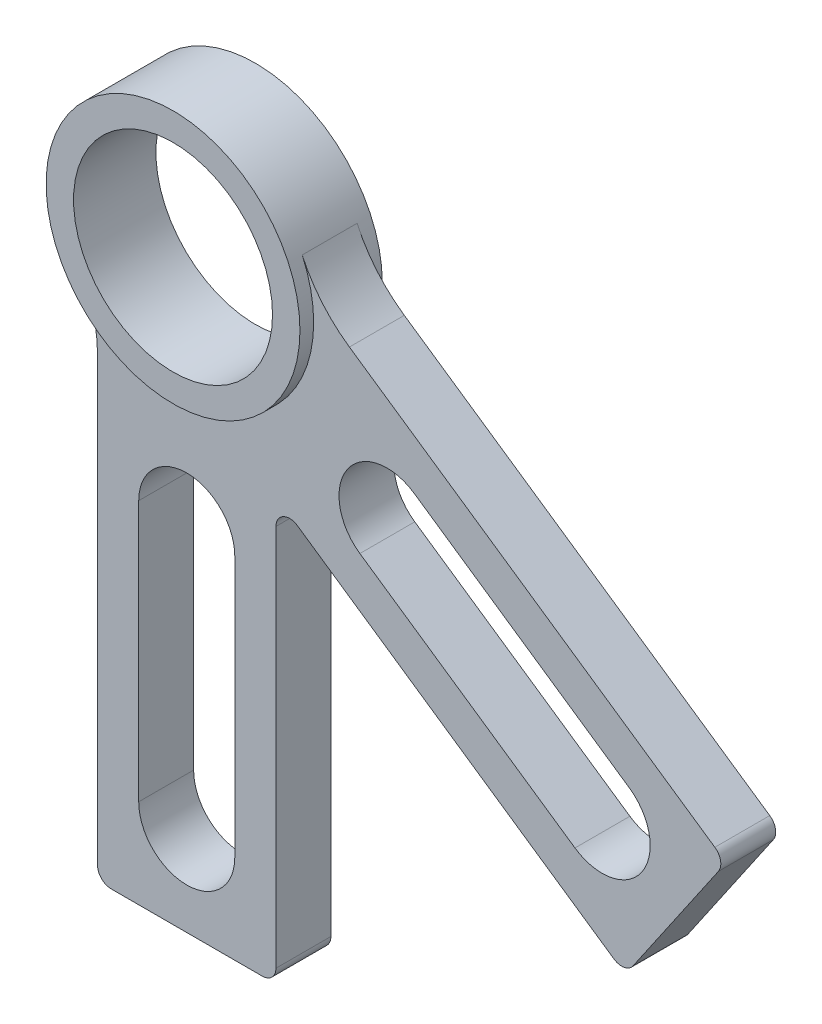
ISO-10303-21;
HEADER;
FILE_DESCRIPTION(('STEP AP214'),'2;1');
FILE_NAME('part.step','',(''),(''),'','','');
FILE_SCHEMA(('AUTOMOTIVE_DESIGN { 1 0 10303 214 1 1 1 1 }'));
ENDSEC;
DATA;
#1=APPLICATION_CONTEXT('core data for automotive mechanical design processes');
#2=APPLICATION_PROTOCOL_DEFINITION('international standard','automotive_design',2000,#1);
#3=PRODUCT_CONTEXT('',#1,'mechanical');
#4=PRODUCT('Part','Part','',(#3));
#5=PRODUCT_RELATED_PRODUCT_CATEGORY('part','',(#4));
#6=PRODUCT_DEFINITION_FORMATION('','',#4);
#7=PRODUCT_DEFINITION_CONTEXT('part definition',#1,'design');
#8=PRODUCT_DEFINITION('design','',#6,#7);
#9=PRODUCT_DEFINITION_SHAPE('','',#8);
#10=(LENGTH_UNIT() NAMED_UNIT(*) SI_UNIT(.MILLI.,.METRE.));
#11=(NAMED_UNIT(*) PLANE_ANGLE_UNIT() SI_UNIT($,.RADIAN.));
#12=(NAMED_UNIT(*) SI_UNIT($,.STERADIAN.) SOLID_ANGLE_UNIT());
#13=UNCERTAINTY_MEASURE_WITH_UNIT(LENGTH_MEASURE(1.E-05),#10,'distance_accuracy_value','');
#14=(GEOMETRIC_REPRESENTATION_CONTEXT(3) GLOBAL_UNCERTAINTY_ASSIGNED_CONTEXT((#13)) GLOBAL_UNIT_ASSIGNED_CONTEXT((#10,
#11,#12)) REPRESENTATION_CONTEXT('',''));
#15=CARTESIAN_POINT('',(0.,0.,0.));
#16=DIRECTION('',(0.,0.,1.));
#17=DIRECTION('',(1.,0.,0.));
#18=AXIS2_PLACEMENT_3D('',#15,#16,#17);
#19=CARTESIAN_POINT('',(0.,-27.9580697939255,-4.7625));
#20=DIRECTION('',(0.,0.,1.));
#21=DIRECTION('',(1.,0.,0.));
#22=AXIS2_PLACEMENT_3D('',#19,#20,#21);
#23=CYLINDRICAL_SURFACE('',#22,5.55624999999843);
#24=DIRECTION('',(0.,0.,1.));
#25=VECTOR('',#24,1.);
#26=CARTESIAN_POINT('',(-5.55624999999843,-27.9580697939256,-4.7625));
#27=LINE('',#26,#25);
#28=CARTESIAN_POINT('',(-5.55624999999845,-27.9580697939256,-3.175));
#29=VERTEX_POINT('',#28);
#30=CARTESIAN_POINT('',(-5.55624999999843,-27.9580697939256,3.175));
#31=VERTEX_POINT('',#30);
#32=EDGE_CURVE('E409',#29,#31,#27,.T.);
#33=ORIENTED_EDGE('',*,*,#32,.F.);
#34=CARTESIAN_POINT('',(0.,-27.9580697939255,-3.175));
#35=DIRECTION('',(0.,0.,1.));
#36=DIRECTION('',(1.,0.,0.));
#37=AXIS2_PLACEMENT_3D('',#34,#35,#36);
#38=CIRCLE('',#37,5.55624999999843);
#39=CARTESIAN_POINT('',(5.55624999999841,-27.9580697939255,-3.175));
#40=VERTEX_POINT('',#39);
#41=EDGE_CURVE('E594',#40,#29,#38,.T.);
#42=ORIENTED_EDGE('',*,*,#41,.F.);
#43=DIRECTION('',(0.,0.,1.));
#44=VECTOR('',#43,1.);
#45=CARTESIAN_POINT('',(5.55624999999843,-27.9580697939256,-4.7625));
#46=LINE('',#45,#44);
#47=CARTESIAN_POINT('',(5.55624999999843,-27.9580697939256,3.175));
#48=VERTEX_POINT('',#47);
#49=EDGE_CURVE('E380',#40,#48,#46,.T.);
#50=ORIENTED_EDGE('',*,*,#49,.T.);
#51=CARTESIAN_POINT('',(0.,-27.9580697939255,3.175));
#52=DIRECTION('',(0.,0.,1.));
#53=DIRECTION('',(1.,0.,0.));
#54=AXIS2_PLACEMENT_3D('',#51,#52,#53);
#55=CIRCLE('',#54,5.55624999999843);
#56=EDGE_CURVE('E548',#48,#31,#55,.T.);
#57=ORIENTED_EDGE('',*,*,#56,.T.);
#58=EDGE_LOOP('',(#33,#42,#50,#57));
#59=FACE_BOUND('',#58,.T.);
#60=ADVANCED_FACE('F207',(#59),#23,.F.);
#61=CARTESIAN_POINT('',(-5.55624999999843,0.,-4.7625));
#62=DIRECTION('',(1.,0.,0.));
#63=DIRECTION('',(0.,1.,0.));
#64=AXIS2_PLACEMENT_3D('',#61,#62,#63);
#65=PLANE('',#64);
#66=DIRECTION('',(0.,1.,0.));
#67=VECTOR('',#66,1.);
#68=CARTESIAN_POINT('',(-5.55624999999843,0.,-3.175));
#69=LINE('',#68,#67);
#70=CARTESIAN_POINT('',(-5.55624999999845,-58.1205697939288,-3.175));
#71=VERTEX_POINT('',#70);
#72=EDGE_CURVE('E596',#71,#29,#69,.T.);
#73=ORIENTED_EDGE('',*,*,#72,.T.);
#74=ORIENTED_EDGE('',*,*,#32,.T.);
#75=DIRECTION('',(0.,-1.,0.));
#76=VECTOR('',#75,1.);
#77=CARTESIAN_POINT('',(-5.55624999999843,0.,3.175));
#78=LINE('',#77,#76);
#79=CARTESIAN_POINT('',(-5.55624999999842,-58.1205697939288,3.175));
#80=VERTEX_POINT('',#79);
#81=EDGE_CURVE('E553',#31,#80,#78,.T.);
#82=ORIENTED_EDGE('',*,*,#81,.T.);
#83=DIRECTION('',(0.,0.,1.));
#84=VECTOR('',#83,1.);
#85=CARTESIAN_POINT('',(-5.55624999999842,-58.1205697939288,-4.7625));
#86=LINE('',#85,#84);
#87=EDGE_CURVE('E625',#71,#80,#86,.T.);
#88=ORIENTED_EDGE('',*,*,#87,.F.);
#89=EDGE_LOOP('',(#73,#74,#82,#88));
#90=FACE_BOUND('',#89,.T.);
#91=ADVANCED_FACE('F629',(#90),#65,.T.);
#92=CARTESIAN_POINT('',(0.,-58.1205697939288,-4.7625));
#93=DIRECTION('',(0.,0.,1.));
#94=DIRECTION('',(1.,0.,0.));
#95=AXIS2_PLACEMENT_3D('',#92,#93,#94);
#96=CYLINDRICAL_SURFACE('',#95,5.55624999999842);
#97=DIRECTION('',(0.,0.,1.));
#98=VECTOR('',#97,1.);
#99=CARTESIAN_POINT('',(5.55624999999842,-58.1205697939288,-4.7625));
#100=LINE('',#99,#98);
#101=CARTESIAN_POINT('',(5.55624999999842,-58.1205697939288,-3.175));
#102=VERTEX_POINT('',#101);
#103=CARTESIAN_POINT('',(5.55624999999842,-58.1205697939288,3.175));
#104=VERTEX_POINT('',#103);
#105=EDGE_CURVE('E382',#102,#104,#100,.T.);
#106=ORIENTED_EDGE('',*,*,#105,.F.);
#107=CARTESIAN_POINT('',(0.,-58.1205697939288,-3.175));
#108=DIRECTION('',(0.,0.,1.));
#109=DIRECTION('',(1.,0.,0.));
#110=AXIS2_PLACEMENT_3D('',#107,#108,#109);
#111=CIRCLE('',#110,5.55624999999842);
#112=EDGE_CURVE('E588',#71,#102,#111,.T.);
#113=ORIENTED_EDGE('',*,*,#112,.F.);
#114=ORIENTED_EDGE('',*,*,#87,.T.);
#115=CARTESIAN_POINT('',(0.,-58.1205697939288,3.175));
#116=DIRECTION('',(0.,0.,1.));
#117=DIRECTION('',(1.,0.,0.));
#118=AXIS2_PLACEMENT_3D('',#115,#116,#117);
#119=CIRCLE('',#118,5.55624999999842);
#120=EDGE_CURVE('E611',#80,#104,#119,.T.);
#121=ORIENTED_EDGE('',*,*,#120,.T.);
#122=EDGE_LOOP('',(#106,#113,#114,#121));
#123=FACE_BOUND('',#122,.T.);
#124=ADVANCED_FACE('F633',(#123),#96,.F.);
#125=CARTESIAN_POINT('',(23.1650589969967,-15.8792690951238,-4.7625));
#126=DIRECTION('',(0.,0.,1.));
#127=DIRECTION('',(1.,0.,0.));
#128=AXIS2_PLACEMENT_3D('',#125,#126,#127);
#129=CYLINDRICAL_SURFACE('',#128,5.5562499999984);
#130=DIRECTION('',(0.,0.,1.));
#131=VECTOR('',#130,1.);
#132=CARTESIAN_POINT('',(20.0235610567339,-20.4621617137443,-4.7625));
#133=LINE('',#132,#131);
#134=CARTESIAN_POINT('',(20.0235610567339,-20.4621617137443,-3.175));
#135=VERTEX_POINT('',#134);
#136=CARTESIAN_POINT('',(20.0235610567339,-20.4621617137443,3.175));
#137=VERTEX_POINT('',#136);
#138=EDGE_CURVE('E372',#135,#137,#133,.T.);
#139=ORIENTED_EDGE('',*,*,#138,.F.);
#140=CARTESIAN_POINT('',(23.1650589969967,-15.8792690951238,-3.175));
#141=DIRECTION('',(0.,0.,1.));
#142=DIRECTION('',(1.,0.,0.));
#143=AXIS2_PLACEMENT_3D('',#140,#141,#142);
#144=CIRCLE('',#143,5.5562499999984);
#145=CARTESIAN_POINT('',(26.3065569372595,-11.2963764765033,-3.175));
#146=VERTEX_POINT('',#145);
#147=EDGE_CURVE('E356',#146,#135,#144,.T.);
#148=ORIENTED_EDGE('',*,*,#147,.F.);
#149=DIRECTION('',(0.,0.,1.));
#150=VECTOR('',#149,1.);
#151=CARTESIAN_POINT('',(26.3065569372595,-11.2963764765033,-4.7625));
#152=LINE('',#151,#150);
#153=CARTESIAN_POINT('',(26.3065569372595,-11.2963764765033,3.175));
#154=VERTEX_POINT('',#153);
#155=EDGE_CURVE('E389',#146,#154,#152,.T.);
#156=ORIENTED_EDGE('',*,*,#155,.T.);
#157=CARTESIAN_POINT('',(23.1650589969967,-15.8792690951238,3.175));
#158=DIRECTION('',(0.,0.,1.));
#159=DIRECTION('',(1.,0.,0.));
#160=AXIS2_PLACEMENT_3D('',#157,#158,#159);
#161=CIRCLE('',#160,5.5562499999984);
#162=EDGE_CURVE('E379',#154,#137,#161,.T.);
#163=ORIENTED_EDGE('',*,*,#162,.T.);
#164=EDGE_LOOP('',(#139,#148,#156,#163));
#165=FACE_BOUND('',#164,.T.);
#166=ADVANCED_FACE('F377',(#165),#129,.F.);
#167=CARTESIAN_POINT('',(-3.14149794026282,-4.58289261862053,-4.7625));
#168=DIRECTION('',(0.565398954378175,0.82481756915579,0.));
#169=DIRECTION('',(-0.82481756915579,0.565398954378175,0.));
#170=AXIS2_PLACEMENT_3D('',#167,#168,#169);
#171=PLANE('',#170);
#172=DIRECTION('',(-0.82481756915579,0.565398954378175,0.));
#173=VECTOR('',#172,1.);
#174=CARTESIAN_POINT('',(-3.14149794026282,-4.58289261862053,-3.175));
#175=LINE('',#174,#173);
#176=CARTESIAN_POINT('',(44.902120986398,-37.5160076751779,-3.175));
#177=VERTEX_POINT('',#176);
#178=EDGE_CURVE('E360',#177,#135,#175,.T.);
#179=ORIENTED_EDGE('',*,*,#178,.T.);
#180=ORIENTED_EDGE('',*,*,#138,.T.);
#181=DIRECTION('',(0.82481756915579,-0.565398954378175,0.));
#182=VECTOR('',#181,1.);
#183=CARTESIAN_POINT('',(-3.14149794026282,-4.58289261862053,3.175));
#184=LINE('',#183,#182);
#185=CARTESIAN_POINT('',(44.9021209863981,-37.5160076751779,3.175));
#186=VERTEX_POINT('',#185);
#187=EDGE_CURVE('E610',#137,#186,#184,.T.);
#188=ORIENTED_EDGE('',*,*,#187,.T.);
#189=DIRECTION('',(0.,0.,1.));
#190=VECTOR('',#189,1.);
#191=CARTESIAN_POINT('',(44.9021209863981,-37.5160076751779,-4.7625));
#192=LINE('',#191,#190);
#193=EDGE_CURVE('E374',#177,#186,#192,.T.);
#194=ORIENTED_EDGE('',*,*,#193,.F.);
#195=EDGE_LOOP('',(#179,#180,#188,#194));
#196=FACE_BOUND('',#195,.T.);
#197=ADVANCED_FACE('F370',(#196),#171,.T.);
#198=CARTESIAN_POINT('',(48.0436189266609,-32.9331150565573,-4.7625));
#199=DIRECTION('',(0.,0.,1.));
#200=DIRECTION('',(1.,0.,0.));
#201=AXIS2_PLACEMENT_3D('',#198,#199,#200);
#202=CYLINDRICAL_SURFACE('',#201,5.5562499999984);
#203=DIRECTION('',(0.,0.,1.));
#204=VECTOR('',#203,1.);
#205=CARTESIAN_POINT('',(51.1851168669237,-28.3502224379368,-4.7625));
#206=LINE('',#205,#204);
#207=CARTESIAN_POINT('',(51.1851168669237,-28.3502224379368,-3.175));
#208=VERTEX_POINT('',#207);
#209=CARTESIAN_POINT('',(51.1851168669237,-28.3502224379368,3.175));
#210=VERTEX_POINT('',#209);
#211=EDGE_CURVE('E384',#208,#210,#206,.T.);
#212=ORIENTED_EDGE('',*,*,#211,.F.);
#213=CARTESIAN_POINT('',(48.0436189266609,-32.9331150565573,-3.175));
#214=DIRECTION('',(0.,0.,1.));
#215=DIRECTION('',(1.,0.,0.));
#216=AXIS2_PLACEMENT_3D('',#213,#214,#215);
#217=CIRCLE('',#216,5.5562499999984);
#218=EDGE_CURVE('E599',#177,#208,#217,.T.);
#219=ORIENTED_EDGE('',*,*,#218,.F.);
#220=ORIENTED_EDGE('',*,*,#193,.T.);
#221=CARTESIAN_POINT('',(48.0436189266609,-32.9331150565573,3.175));
#222=DIRECTION('',(0.,0.,1.));
#223=DIRECTION('',(1.,0.,0.));
#224=AXIS2_PLACEMENT_3D('',#221,#222,#223);
#225=CIRCLE('',#224,5.5562499999984);
#226=EDGE_CURVE('E538',#186,#210,#225,.T.);
#227=ORIENTED_EDGE('',*,*,#226,.T.);
#228=EDGE_LOOP('',(#212,#219,#220,#227));
#229=FACE_BOUND('',#228,.T.);
#230=ADVANCED_FACE('F606',(#229),#202,.F.);
#231=CARTESIAN_POINT('',(27.7878622659884,12.7088972427335,-4.7625));
#232=DIRECTION('',(0.,0.,1.));
#233=DIRECTION('',(1.,0.,0.));
#234=AXIS2_PLACEMENT_3D('',#231,#232,#233);
#235=CYLINDRICAL_SURFACE('',#234,15.8749999999984);
#236=CARTESIAN_POINT('',(27.7878622659884,12.7088972427335,-3.175));
#237=DIRECTION('',(0.,0.,1.));
#238=DIRECTION('',(1.,0.,0.));
#239=AXIS2_PLACEMENT_3D('',#236,#237,#238);
#240=CIRCLE('',#239,15.8749999999984);
#241=CARTESIAN_POINT('',(13.3511092184058,6.10618670515409,-3.175));
#242=VERTEX_POINT('',#241);
#243=CARTESIAN_POINT('',(18.8121538652358,-0.385081667613318,-3.175));
#244=VERTEX_POINT('',#243);
#245=EDGE_CURVE('E522',#242,#244,#240,.T.);
#246=ORIENTED_EDGE('',*,*,#245,.F.);
#247=DIRECTION('',(0.,0.,1.));
#248=VECTOR('',#247,1.);
#249=CARTESIAN_POINT('',(13.3511092184058,6.10618670515408,-4.7625));
#250=LINE('',#249,#248);
#251=CARTESIAN_POINT('',(13.3511092184058,6.10618670515408,3.175));
#252=VERTEX_POINT('',#251);
#253=EDGE_CURVE('E391',#242,#252,#250,.T.);
#254=ORIENTED_EDGE('',*,*,#253,.T.);
#255=CARTESIAN_POINT('',(27.7878622659884,12.7088972427335,3.175));
#256=DIRECTION('',(0.,0.,1.));
#257=DIRECTION('',(1.,0.,0.));
#258=AXIS2_PLACEMENT_3D('',#255,#256,#257);
#259=CIRCLE('',#258,15.8749999999984);
#260=CARTESIAN_POINT('',(18.8121538652358,-0.385081667613316,3.175));
#261=VERTEX_POINT('',#260);
#262=EDGE_CURVE('E500',#252,#261,#259,.T.);
#263=ORIENTED_EDGE('',*,*,#262,.T.);
#264=DIRECTION('',(0.,0.,1.));
#265=VECTOR('',#264,1.);
#266=CARTESIAN_POINT('',(18.8121538652358,-0.385081667613316,-4.7625));
#267=LINE('',#266,#265);
#268=EDGE_CURVE('E393',#244,#261,#267,.T.);
#269=ORIENTED_EDGE('',*,*,#268,.F.);
#270=EDGE_LOOP('',(#246,#254,#263,#269));
#271=FACE_BOUND('',#270,.T.);
#272=ADVANCED_FACE('F570',(#271),#235,.F.);
#273=CARTESIAN_POINT('',(5.83421046048889,8.51108629172498,-4.7625));
#274=DIRECTION('',(0.565398954378175,0.82481756915579,0.));
#275=DIRECTION('',(-0.82481756915579,0.565398954378175,0.));
#276=AXIS2_PLACEMENT_3D('',#273,#274,#275);
#277=PLANE('',#276);
#278=DIRECTION('',(0.82481756915579,-0.565398954378175,0.));
#279=VECTOR('',#278,1.);
#280=CARTESIAN_POINT('',(5.83421046048889,8.51108629172498,3.175));
#281=LINE('',#280,#279);
#282=CARTESIAN_POINT('',(61.0795177878399,-29.3586683852459,3.175));
#283=VERTEX_POINT('',#282);
#284=EDGE_CURVE('E564',#261,#283,#281,.T.);
#285=ORIENTED_EDGE('',*,*,#284,.T.);
#286=DIRECTION('',(0.,0.,1.));
#287=VECTOR('',#286,1.);
#288=CARTESIAN_POINT('',(61.0795177878399,-29.3586683852459,-4.7625));
#289=LINE('',#288,#287);
#290=CARTESIAN_POINT('',(61.0795177878399,-29.3586683852459,-3.175));
#291=VERTEX_POINT('',#290);
#292=EDGE_CURVE('E420',#283,#291,#289,.F.);
#293=ORIENTED_EDGE('',*,*,#292,.T.);
#294=DIRECTION('',(-0.82481756915579,0.565398954378175,0.));
#295=VECTOR('',#294,1.);
#296=CARTESIAN_POINT('',(5.83421046048889,8.51108629172498,-3.175));
#297=LINE('',#296,#295);
#298=EDGE_CURVE('E531',#291,#244,#297,.T.);
#299=ORIENTED_EDGE('',*,*,#298,.T.);
#300=ORIENTED_EDGE('',*,*,#268,.T.);
#301=EDGE_LOOP('',(#285,#293,#299,#300));
#302=FACE_BOUND('',#301,.T.);
#303=ADVANCED_FACE('F657',(#302),#277,.T.);
#304=CARTESIAN_POINT('',(56.5547052183859,-38.7673255170462,-4.7625));
#305=DIRECTION('',(0.82481756915579,-0.565398954378175,0.));
#306=DIRECTION('',(0.565398954378175,0.82481756915579,0.));
#307=AXIS2_PLACEMENT_3D('',#304,#305,#306);
#308=PLANE('',#307);
#309=DIRECTION('',(0.565398954378175,0.82481756915579,0.));
#310=VECTOR('',#309,1.);
#311=CARTESIAN_POINT('',(56.5547052183859,-38.7673255170462,-3.175));
#312=LINE('',#311,#310);
#313=CARTESIAN_POINT('',(51.6180655979723,-45.9690139177364,-3.175));
#314=VERTEX_POINT('',#313);
#315=CARTESIAN_POINT('',(61.4913448387994,-31.5656371163561,-3.175));
#316=VERTEX_POINT('',#315);
#317=EDGE_CURVE('E533',#314,#316,#312,.T.);
#318=ORIENTED_EDGE('',*,*,#317,.T.);
#319=DIRECTION('',(0.,0.,1.));
#320=VECTOR('',#319,1.);
#321=CARTESIAN_POINT('',(61.4913448387994,-31.5656371163561,-4.7625));
#322=LINE('',#321,#320);
#323=CARTESIAN_POINT('',(61.4913448387994,-31.5656371163561,3.175));
#324=VERTEX_POINT('',#323);
#325=EDGE_CURVE('E408',#316,#324,#322,.T.);
#326=ORIENTED_EDGE('',*,*,#325,.T.);
#327=DIRECTION('',(-0.565398954378175,-0.82481756915579,0.));
#328=VECTOR('',#327,1.);
#329=CARTESIAN_POINT('',(56.5547052183859,-38.7673255170462,3.175));
#330=LINE('',#329,#328);
#331=CARTESIAN_POINT('',(51.6180655979723,-45.9690139177364,3.175));
#332=VERTEX_POINT('',#331);
#333=EDGE_CURVE('E562',#324,#332,#330,.T.);
#334=ORIENTED_EDGE('',*,*,#333,.T.);
#335=DIRECTION('',(0.,0.,1.));
#336=VECTOR('',#335,1.);
#337=CARTESIAN_POINT('',(51.6180655979723,-45.9690139177364,-3.175));
#338=LINE('',#337,#336);
#339=EDGE_CURVE('E406',#332,#314,#338,.F.);
#340=ORIENTED_EDGE('',*,*,#339,.T.);
#341=EDGE_LOOP('',(#318,#326,#334,#340));
#342=FACE_BOUND('',#341,.T.);
#343=ADVANCED_FACE('F576',(#342),#308,.T.);
#344=CARTESIAN_POINT('',(-5.83421046048888,-8.51108629172497,-4.7625));
#345=DIRECTION('',(0.565398954378175,0.82481756915579,0.));
#346=DIRECTION('',(-0.82481756915579,0.565398954378175,0.));
#347=AXIS2_PLACEMENT_3D('',#344,#345,#346);
#348=PLANE('',#347);
#349=DIRECTION('',(-0.82481756915579,0.565398954378175,0.));
#350=VECTOR('',#349,1.);
#351=CARTESIAN_POINT('',(-5.83421046048888,-8.51108629172497,-3.175));
#352=LINE('',#351,#350);
#353=CARTESIAN_POINT('',(49.4110968668622,-46.3808409686959,-3.175));
#354=VERTEX_POINT('',#353);
#355=CARTESIAN_POINT('',(12.8038208400738,-21.2871519371155,-3.175));
#356=VERTEX_POINT('',#355);
#357=EDGE_CURVE('E536',#354,#356,#352,.T.);
#358=ORIENTED_EDGE('',*,*,#357,.F.);
#359=DIRECTION('',(0.,0.,1.));
#360=VECTOR('',#359,1.);
#361=CARTESIAN_POINT('',(49.4110968668622,-46.3808409686959,3.175));
#362=LINE('',#361,#360);
#363=CARTESIAN_POINT('',(49.4110968668622,-46.3808409686959,3.175));
#364=VERTEX_POINT('',#363);
#365=EDGE_CURVE('E428',#354,#364,#362,.T.);
#366=ORIENTED_EDGE('',*,*,#365,.T.);
#367=DIRECTION('',(0.82481756915579,-0.565398954378175,0.));
#368=VECTOR('',#367,1.);
#369=CARTESIAN_POINT('',(-5.83421046048888,-8.51108629172497,3.175));
#370=LINE('',#369,#368);
#371=CARTESIAN_POINT('',(12.8038208400738,-21.2871519371155,3.175));
#372=VERTEX_POINT('',#371);
#373=EDGE_CURVE('E559',#372,#364,#370,.T.);
#374=ORIENTED_EDGE('',*,*,#373,.F.);
#375=DIRECTION('',(0.,0.,1.));
#376=VECTOR('',#375,1.);
#377=CARTESIAN_POINT('',(12.8038208400738,-21.2871519371155,-4.7625));
#378=LINE('',#377,#376);
#379=EDGE_CURVE('E395',#356,#372,#378,.T.);
#380=ORIENTED_EDGE('',*,*,#379,.F.);
#381=EDGE_LOOP('',(#358,#366,#374,#380));
#382=FACE_BOUND('',#381,.T.);
#383=ADVANCED_FACE('F584',(#382),#348,.F.);
#384=CARTESIAN_POINT('',(11.9062499999984,-22.5965498281503,-4.7625));
#385=DIRECTION('',(0.,0.,1.));
#386=DIRECTION('',(1.,0.,0.));
#387=AXIS2_PLACEMENT_3D('',#384,#385,#386);
#388=CYLINDRICAL_SURFACE('',#387,1.5875);
#389=DIRECTION('',(0.,0.,1.));
#390=VECTOR('',#389,1.);
#391=CARTESIAN_POINT('',(10.3187499999984,-22.5965498281503,-4.7625));
#392=LINE('',#391,#390);
#393=CARTESIAN_POINT('',(10.3187499999984,-22.5965498281503,-3.175));
#394=VERTEX_POINT('',#393);
#395=CARTESIAN_POINT('',(10.3187499999984,-22.5965498281503,3.175));
#396=VERTEX_POINT('',#395);
#397=EDGE_CURVE('E397',#394,#396,#392,.T.);
#398=ORIENTED_EDGE('',*,*,#397,.F.);
#399=CARTESIAN_POINT('',(11.9062499999984,-22.5965498281503,-3.175));
#400=DIRECTION('',(0.,0.,1.));
#401=DIRECTION('',(1.,0.,0.));
#402=AXIS2_PLACEMENT_3D('',#399,#400,#401);
#403=CIRCLE('',#402,1.5875);
#404=EDGE_CURVE('E449',#356,#394,#403,.T.);
#405=ORIENTED_EDGE('',*,*,#404,.F.);
#406=ORIENTED_EDGE('',*,*,#379,.T.);
#407=CARTESIAN_POINT('',(11.9062499999984,-22.5965498281503,3.175));
#408=DIRECTION('',(0.,0.,1.));
#409=DIRECTION('',(1.,0.,0.));
#410=AXIS2_PLACEMENT_3D('',#407,#408,#409);
#411=CIRCLE('',#410,1.5875);
#412=EDGE_CURVE('E466',#372,#396,#411,.T.);
#413=ORIENTED_EDGE('',*,*,#412,.T.);
#414=EDGE_LOOP('',(#398,#405,#406,#413));
#415=FACE_BOUND('',#414,.T.);
#416=ADVANCED_FACE('F587',(#415),#388,.F.);
#417=CARTESIAN_POINT('',(10.3187499999984,0.,-4.7625));
#418=DIRECTION('',(-1.,0.,0.));
#419=DIRECTION('',(0.,-1.,0.));
#420=AXIS2_PLACEMENT_3D('',#417,#418,#419);
#421=PLANE('',#420);
#422=DIRECTION('',(0.,1.,0.));
#423=VECTOR('',#422,1.);
#424=CARTESIAN_POINT('',(10.3187499999984,0.,3.175));
#425=LINE('',#424,#423);
#426=CARTESIAN_POINT('',(10.3187499999984,-66.8518197939272,3.175));
#427=VERTEX_POINT('',#426);
#428=EDGE_CURVE('E443',#427,#396,#425,.T.);
#429=ORIENTED_EDGE('',*,*,#428,.F.);
#430=DIRECTION('',(0.,0.,1.));
#431=VECTOR('',#430,1.);
#432=CARTESIAN_POINT('',(10.3187499999984,-66.8518197939272,-3.175));
#433=LINE('',#432,#431);
#434=CARTESIAN_POINT('',(10.3187499999984,-66.8518197939272,-3.175));
#435=VERTEX_POINT('',#434);
#436=EDGE_CURVE('E215',#427,#435,#433,.F.);
#437=ORIENTED_EDGE('',*,*,#436,.T.);
#438=DIRECTION('',(0.,-1.,0.));
#439=VECTOR('',#438,1.);
#440=CARTESIAN_POINT('',(10.3187499999984,0.,-3.175));
#441=LINE('',#440,#439);
#442=EDGE_CURVE('E441',#394,#435,#441,.T.);
#443=ORIENTED_EDGE('',*,*,#442,.F.);
#444=ORIENTED_EDGE('',*,*,#397,.T.);
#445=EDGE_LOOP('',(#429,#437,#443,#444));
#446=FACE_BOUND('',#445,.T.);
#447=ADVANCED_FACE('F440',(#446),#421,.F.);
#448=CARTESIAN_POINT('',(0.,-68.4393197939272,-4.7625));
#449=DIRECTION('',(0.,-1.,0.));
#450=DIRECTION('',(1.,0.,0.));
#451=AXIS2_PLACEMENT_3D('',#448,#449,#450);
#452=PLANE('',#451);
#453=DIRECTION('',(1.,0.,0.));
#454=VECTOR('',#453,1.);
#455=CARTESIAN_POINT('',(0.,-68.4393197939272,-3.175));
#456=LINE('',#455,#454);
#457=CARTESIAN_POINT('',(-8.73124999999842,-68.4393197939272,-3.175));
#458=VERTEX_POINT('',#457);
#459=CARTESIAN_POINT('',(8.73124999999836,-68.4393197939272,-3.175));
#460=VERTEX_POINT('',#459);
#461=EDGE_CURVE('E450',#458,#460,#456,.T.);
#462=ORIENTED_EDGE('',*,*,#461,.T.);
#463=DIRECTION('',(0.,0.,1.));
#464=VECTOR('',#463,1.);
#465=CARTESIAN_POINT('',(8.73124999999836,-68.4393197939272,3.175));
#466=LINE('',#465,#464);
#467=CARTESIAN_POINT('',(8.73124999999836,-68.4393197939272,3.175));
#468=VERTEX_POINT('',#467);
#469=EDGE_CURVE('E433',#460,#468,#466,.T.);
#470=ORIENTED_EDGE('',*,*,#469,.T.);
#471=DIRECTION('',(-1.,0.,0.));
#472=VECTOR('',#471,1.);
#473=CARTESIAN_POINT('',(0.,-68.4393197939272,3.175));
#474=LINE('',#473,#472);
#475=CARTESIAN_POINT('',(-8.73124999999842,-68.4393197939272,3.175));
#476=VERTEX_POINT('',#475);
#477=EDGE_CURVE('E458',#468,#476,#474,.T.);
#478=ORIENTED_EDGE('',*,*,#477,.T.);
#479=DIRECTION('',(0.,0.,1.));
#480=VECTOR('',#479,1.);
#481=CARTESIAN_POINT('',(-8.73124999999842,-68.4393197939272,-4.7625));
#482=LINE('',#481,#480);
#483=EDGE_CURVE('E431',#476,#458,#482,.F.);
#484=ORIENTED_EDGE('',*,*,#483,.T.);
#485=EDGE_LOOP('',(#462,#470,#478,#484));
#486=FACE_BOUND('',#485,.T.);
#487=ADVANCED_FACE('F457',(#486),#452,.T.);
#488=CARTESIAN_POINT('',(-10.3187499999984,0.,-4.7625));
#489=DIRECTION('',(-1.,0.,0.));
#490=DIRECTION('',(0.,-1.,0.));
#491=AXIS2_PLACEMENT_3D('',#488,#489,#490);
#492=PLANE('',#491);
#493=DIRECTION('',(0.,-1.,0.));
#494=VECTOR('',#493,1.);
#495=CARTESIAN_POINT('',(-10.3187499999984,0.,-3.175));
#496=LINE('',#495,#494);
#497=CARTESIAN_POINT('',(-10.3187499999984,-15.7343197939272,-3.175));
#498=VERTEX_POINT('',#497);
#499=CARTESIAN_POINT('',(-10.3187499999984,-66.8518197939272,-3.175));
#500=VERTEX_POINT('',#499);
#501=EDGE_CURVE('E525',#498,#500,#496,.T.);
#502=ORIENTED_EDGE('',*,*,#501,.T.);
#503=DIRECTION('',(0.,0.,1.));
#504=VECTOR('',#503,1.);
#505=CARTESIAN_POINT('',(-10.3187499999984,-66.8518197939272,-4.7625));
#506=LINE('',#505,#504);
#507=CARTESIAN_POINT('',(-10.3187499999984,-66.8518197939272,3.175));
#508=VERTEX_POINT('',#507);
#509=EDGE_CURVE('E13',#500,#508,#506,.T.);
#510=ORIENTED_EDGE('',*,*,#509,.T.);
#511=DIRECTION('',(0.,1.,0.));
#512=VECTOR('',#511,1.);
#513=CARTESIAN_POINT('',(-10.3187499999984,0.,3.175));
#514=LINE('',#513,#512);
#515=CARTESIAN_POINT('',(-10.3187499999984,-15.7343197939272,3.175));
#516=VERTEX_POINT('',#515);
#517=EDGE_CURVE('E464',#508,#516,#514,.T.);
#518=ORIENTED_EDGE('',*,*,#517,.T.);
#519=DIRECTION('',(0.,0.,1.));
#520=VECTOR('',#519,1.);
#521=CARTESIAN_POINT('',(-10.3187499999984,-15.7343197939272,-4.7625));
#522=LINE('',#521,#520);
#523=EDGE_CURVE('E400',#498,#516,#522,.T.);
#524=ORIENTED_EDGE('',*,*,#523,.F.);
#525=EDGE_LOOP('',(#502,#510,#518,#524));
#526=FACE_BOUND('',#525,.T.);
#527=ADVANCED_FACE('F653',(#526),#492,.T.);
#528=CARTESIAN_POINT('',(3.14149794026284,4.58289261862055,-4.7625));
#529=DIRECTION('',(0.565398954378175,0.82481756915579,0.));
#530=DIRECTION('',(-0.82481756915579,0.565398954378175,0.));
#531=AXIS2_PLACEMENT_3D('',#528,#529,#530);
#532=PLANE('',#531);
#533=ORIENTED_EDGE('',*,*,#155,.F.);
#534=DIRECTION('',(-0.82481756915579,0.565398954378175,0.));
#535=VECTOR('',#534,1.);
#536=CARTESIAN_POINT('',(3.14149794026284,4.58289261862055,-3.175));
#537=LINE('',#536,#535);
#538=EDGE_CURVE('E363',#208,#146,#537,.T.);
#539=ORIENTED_EDGE('',*,*,#538,.F.);
#540=ORIENTED_EDGE('',*,*,#211,.T.);
#541=DIRECTION('',(0.82481756915579,-0.565398954378175,0.));
#542=VECTOR('',#541,1.);
#543=CARTESIAN_POINT('',(3.14149794026284,4.58289261862055,3.175));
#544=LINE('',#543,#542);
#545=EDGE_CURVE('E541',#154,#210,#544,.T.);
#546=ORIENTED_EDGE('',*,*,#545,.F.);
#547=EDGE_LOOP('',(#533,#539,#540,#546));
#548=FACE_BOUND('',#547,.T.);
#549=ADVANCED_FACE('F604',(#548),#532,.F.);
#550=CARTESIAN_POINT('',(-26.1937499999968,-15.7343197939272,-4.7625));
#551=DIRECTION('',(0.,0.,1.));
#552=DIRECTION('',(1.,0.,0.));
#553=AXIS2_PLACEMENT_3D('',#550,#551,#552);
#554=CYLINDRICAL_SURFACE('',#553,15.8749999999984);
#555=DIRECTION('',(0.,0.,1.));
#556=VECTOR('',#555,1.);
#557=CARTESIAN_POINT('',(-12.5851932668321,-7.55979787272684,-4.7625));
#558=LINE('',#557,#556);
#559=CARTESIAN_POINT('',(-12.5851932668321,-7.55979787272683,-3.175));
#560=VERTEX_POINT('',#559);
#561=CARTESIAN_POINT('',(-12.5851932668321,-7.55979787272683,3.175));
#562=VERTEX_POINT('',#561);
#563=EDGE_CURVE('E403',#560,#562,#558,.T.);
#564=ORIENTED_EDGE('',*,*,#563,.F.);
#565=CARTESIAN_POINT('',(-26.1937499999968,-15.7343197939272,-3.175));
#566=DIRECTION('',(0.,0.,1.));
#567=DIRECTION('',(1.,0.,0.));
#568=AXIS2_PLACEMENT_3D('',#565,#566,#567);
#569=CIRCLE('',#568,15.8749999999984);
#570=EDGE_CURVE('E523',#498,#560,#569,.T.);
#571=ORIENTED_EDGE('',*,*,#570,.F.);
#572=ORIENTED_EDGE('',*,*,#523,.T.);
#573=CARTESIAN_POINT('',(-26.1937499999968,-15.7343197939272,3.175));
#574=DIRECTION('',(0.,0.,1.));
#575=DIRECTION('',(1.,0.,0.));
#576=AXIS2_PLACEMENT_3D('',#573,#574,#575);
#577=CIRCLE('',#576,15.8749999999984);
#578=EDGE_CURVE('E468',#516,#562,#577,.T.);
#579=ORIENTED_EDGE('',*,*,#578,.T.);
#580=EDGE_LOOP('',(#564,#571,#572,#579));
#581=FACE_BOUND('',#580,.T.);
#582=ADVANCED_FACE('F507',(#581),#554,.F.);
#583=CARTESIAN_POINT('',(5.55624999999843,0.,-4.7625));
#584=DIRECTION('',(1.,0.,0.));
#585=DIRECTION('',(0.,1.,0.));
#586=AXIS2_PLACEMENT_3D('',#583,#584,#585);
#587=PLANE('',#586);
#588=ORIENTED_EDGE('',*,*,#49,.F.);
#589=DIRECTION('',(0.,1.,0.));
#590=VECTOR('',#589,1.);
#591=CARTESIAN_POINT('',(5.55624999999843,0.,-3.175));
#592=LINE('',#591,#590);
#593=EDGE_CURVE('E590',#102,#40,#592,.T.);
#594=ORIENTED_EDGE('',*,*,#593,.F.);
#595=ORIENTED_EDGE('',*,*,#105,.T.);
#596=DIRECTION('',(0.,-1.,0.));
#597=VECTOR('',#596,1.);
#598=CARTESIAN_POINT('',(5.55624999999843,0.,3.175));
#599=LINE('',#598,#597);
#600=EDGE_CURVE('E554',#48,#104,#599,.T.);
#601=ORIENTED_EDGE('',*,*,#600,.F.);
#602=EDGE_LOOP('',(#588,#594,#595,#601));
#603=FACE_BOUND('',#602,.T.);
#604=ADVANCED_FACE('F622',(#603),#587,.F.);
#605=CARTESIAN_POINT('',(0.,0.,4.7625));
#606=DIRECTION('',(0.,0.,1.));
#607=DIRECTION('',(1.,0.,0.));
#608=AXIS2_PLACEMENT_3D('',#605,#606,#607);
#609=PLANE('',#608);
#610=CARTESIAN_POINT('',(0.,0.,4.7625));
#611=DIRECTION('',(0.,0.,1.));
#612=DIRECTION('',(1.,0.,0.));
#613=AXIS2_PLACEMENT_3D('',#610,#611,#612);
#614=CIRCLE('',#613,11.5062);
#615=CARTESIAN_POINT('',(11.5062,0.,4.7625));
#616=VERTEX_POINT('',#615);
#617=EDGE_CURVE('E473',#616,#616,#614,.T.);
#618=ORIENTED_EDGE('',*,*,#617,.F.);
#619=EDGE_LOOP('',(#618));
#620=FACE_BOUND('',#619,.T.);
#621=CARTESIAN_POINT('',(0.,0.,4.7625));
#622=DIRECTION('',(0.,0.,1.));
#623=DIRECTION('',(1.,0.,0.));
#624=AXIS2_PLACEMENT_3D('',#621,#622,#623);
#625=CIRCLE('',#624,14.6812);
#626=CARTESIAN_POINT('',(14.6812,0.,4.7625));
#627=VERTEX_POINT('',#626);
#628=EDGE_CURVE('E477',#627,#627,#625,.T.);
#629=ORIENTED_EDGE('',*,*,#628,.T.);
#630=EDGE_LOOP('',(#629));
#631=FACE_BOUND('',#630,.T.);
#632=ADVANCED_FACE('F678',(#620,#631),#609,.T.);
#633=CARTESIAN_POINT('',(0.,0.,-4.7625));
#634=DIRECTION('',(0.,0.,1.));
#635=DIRECTION('',(1.,0.,0.));
#636=AXIS2_PLACEMENT_3D('',#633,#634,#635);
#637=CYLINDRICAL_SURFACE('',#636,14.6812);
#638=ORIENTED_EDGE('',*,*,#253,.F.);
#639=CARTESIAN_POINT('',(0.,0.,-3.175));
#640=DIRECTION('',(0.,0.,1.));
#641=DIRECTION('',(1.,0.,0.));
#642=AXIS2_PLACEMENT_3D('',#639,#640,#641);
#643=CIRCLE('',#642,14.6812);
#644=EDGE_CURVE('E518',#560,#242,#643,.T.);
#645=ORIENTED_EDGE('',*,*,#644,.F.);
#646=ORIENTED_EDGE('',*,*,#563,.T.);
#647=CARTESIAN_POINT('',(0.,0.,3.175));
#648=DIRECTION('',(0.,0.,1.));
#649=DIRECTION('',(1.,0.,0.));
#650=AXIS2_PLACEMENT_3D('',#647,#648,#649);
#651=CIRCLE('',#650,14.6812);
#652=EDGE_CURVE('E496',#562,#252,#651,.T.);
#653=ORIENTED_EDGE('',*,*,#652,.T.);
#654=EDGE_LOOP('',(#638,#645,#646,#653));
#655=FACE_BOUND('',#654,.T.);
#656=ORIENTED_EDGE('',*,*,#628,.F.);
#657=EDGE_LOOP('',(#656));
#658=FACE_BOUND('',#657,.T.);
#659=CARTESIAN_POINT('',(0.,0.,-4.7625));
#660=DIRECTION('',(0.,0.,1.));
#661=DIRECTION('',(1.,0.,0.));
#662=AXIS2_PLACEMENT_3D('',#659,#660,#661);
#663=CIRCLE('',#662,14.6812);
#664=CARTESIAN_POINT('',(14.6812,0.,-4.7625));
#665=VERTEX_POINT('',#664);
#666=EDGE_CURVE('E405',#665,#665,#663,.T.);
#667=ORIENTED_EDGE('',*,*,#666,.T.);
#668=EDGE_LOOP('',(#667));
#669=FACE_BOUND('',#668,.T.);
#670=ADVANCED_FACE('F516',(#655,#658,#669),#637,.T.);
#671=CARTESIAN_POINT('',(0.,0.,-4.7625));
#672=DIRECTION('',(0.,0.,1.));
#673=DIRECTION('',(1.,0.,0.));
#674=AXIS2_PLACEMENT_3D('',#671,#672,#673);
#675=CYLINDRICAL_SURFACE('',#674,11.5062);
#676=CARTESIAN_POINT('',(0.,0.,-4.7625));
#677=DIRECTION('',(0.,0.,1.));
#678=DIRECTION('',(1.,0.,0.));
#679=AXIS2_PLACEMENT_3D('',#676,#677,#678);
#680=CIRCLE('',#679,11.5062);
#681=CARTESIAN_POINT('',(11.5062,0.,-4.7625));
#682=VERTEX_POINT('',#681);
#683=EDGE_CURVE('E488',#682,#682,#680,.T.);
#684=CARTESIAN_POINT('',(11.5062,0.,-4.7625));
#685=CARTESIAN_POINT('',(11.5062,0.,-4.66328125));
#686=CARTESIAN_POINT('',(11.5062,0.,-4.5640625));
#687=CARTESIAN_POINT('',(11.5062,0.,-4.365625));
#688=CARTESIAN_POINT('',(11.5062,0.,-4.26640625));
#689=CARTESIAN_POINT('',(11.5062,0.,-4.06796875));
#690=CARTESIAN_POINT('',(11.5062,0.,-3.96875));
#691=CARTESIAN_POINT('',(11.5062,0.,-3.7703125));
#692=CARTESIAN_POINT('',(11.5062,0.,-3.67109375));
#693=CARTESIAN_POINT('',(11.5062,0.,-3.47265625));
#694=CARTESIAN_POINT('',(11.5062,0.,-3.3734375));
#695=CARTESIAN_POINT('',(11.5062,0.,-3.175));
#696=CARTESIAN_POINT('',(11.5062,0.,-3.07578125));
#697=CARTESIAN_POINT('',(11.5062,0.,-2.87734375));
#698=CARTESIAN_POINT('',(11.5062,0.,-2.778125));
#699=CARTESIAN_POINT('',(11.5062,0.,-2.5796875));
#700=CARTESIAN_POINT('',(11.5062,0.,-2.48046875));
#701=CARTESIAN_POINT('',(11.5062,0.,-2.28203125));
#702=CARTESIAN_POINT('',(11.5062,0.,-2.1828125));
#703=CARTESIAN_POINT('',(11.5062,0.,-1.984375));
#704=CARTESIAN_POINT('',(11.5062,0.,-1.88515625));
#705=CARTESIAN_POINT('',(11.5062,0.,-1.68671875));
#706=CARTESIAN_POINT('',(11.5062,0.,-1.5875));
#707=CARTESIAN_POINT('',(11.5062,0.,-1.3890625));
#708=CARTESIAN_POINT('',(11.5062,0.,-1.28984375));
#709=CARTESIAN_POINT('',(11.5062,0.,-1.09140625));
#710=CARTESIAN_POINT('',(11.5062,0.,-0.9921875));
#711=CARTESIAN_POINT('',(11.5062,0.,-0.79375));
#712=CARTESIAN_POINT('',(11.5062,0.,-0.69453125));
#713=CARTESIAN_POINT('',(11.5062,0.,-0.49609375));
#714=CARTESIAN_POINT('',(11.5062,0.,-0.396875));
#715=CARTESIAN_POINT('',(11.5062,0.,-0.1984375));
#716=CARTESIAN_POINT('',(11.5062,0.,-0.0992187500000001));
#717=CARTESIAN_POINT('',(11.5062,0.,0.0992187500000001));
#718=CARTESIAN_POINT('',(11.5062,0.,0.1984375));
#719=CARTESIAN_POINT('',(11.5062,0.,0.396875));
#720=CARTESIAN_POINT('',(11.5062,0.,0.49609375));
#721=CARTESIAN_POINT('',(11.5062,0.,0.69453125));
#722=CARTESIAN_POINT('',(11.5062,0.,0.793750000000001));
#723=CARTESIAN_POINT('',(11.5062,0.,0.992187500000001));
#724=CARTESIAN_POINT('',(11.5062,0.,1.09140625));
#725=CARTESIAN_POINT('',(11.5062,0.,1.28984375));
#726=CARTESIAN_POINT('',(11.5062,0.,1.3890625));
#727=CARTESIAN_POINT('',(11.5062,0.,1.5875));
#728=CARTESIAN_POINT('',(11.5062,0.,1.68671875));
#729=CARTESIAN_POINT('',(11.5062,0.,1.88515625));
#730=CARTESIAN_POINT('',(11.5062,0.,1.984375));
#731=CARTESIAN_POINT('',(11.5062,0.,2.1828125));
#732=CARTESIAN_POINT('',(11.5062,0.,2.28203125));
#733=CARTESIAN_POINT('',(11.5062,0.,2.48046875));
#734=CARTESIAN_POINT('',(11.5062,0.,2.5796875));
#735=CARTESIAN_POINT('',(11.5062,0.,2.778125));
#736=CARTESIAN_POINT('',(11.5062,0.,2.87734375));
#737=CARTESIAN_POINT('',(11.5062,0.,3.07578125));
#738=CARTESIAN_POINT('',(11.5062,0.,3.175));
#739=CARTESIAN_POINT('',(11.5062,0.,3.3734375));
#740=CARTESIAN_POINT('',(11.5062,0.,3.47265625));
#741=CARTESIAN_POINT('',(11.5062,0.,3.67109375));
#742=CARTESIAN_POINT('',(11.5062,0.,3.7703125));
#743=CARTESIAN_POINT('',(11.5062,0.,3.96875));
#744=CARTESIAN_POINT('',(11.5062,0.,4.06796875));
#745=CARTESIAN_POINT('',(11.5062,0.,4.26640625));
#746=CARTESIAN_POINT('',(11.5062,0.,4.365625));
#747=CARTESIAN_POINT('',(11.5062,0.,4.5640625));
#748=CARTESIAN_POINT('',(11.5062,0.,4.66328125));
#749=CARTESIAN_POINT('',(11.5062,0.,4.7625));
#750=B_SPLINE_CURVE_WITH_KNOTS('',3,(#684,#685,#686,#687,#688,#689,#690,#691,#692,#693,#694,
#695,#696,#697,#698,#699,#700,#701,#702,#703,#704,#705,#706,#707,#708,#709,#710,#711,#712,#713,
#714,#715,#716,#717,#718,#719,#720,#721,#722,#723,#724,#725,#726,#727,#728,#729,#730,#731,#732,
#733,#734,#735,#736,#737,#738,#739,#740,#741,#742,#743,#744,#745,#746,#747,#748,#749),
.UNSPECIFIED.,.F.,.F.,(4,2,2,2,2,2,2,2,2,2,2,2,2,2,2,2,2,2,2,2,2,2,2,2,2,2,2,2,2,2,2,2,4),(0.,
0.297656249999999,0.595312499999999,0.89296875,1.190625,1.48828125,1.7859375,2.08359375,2.38125,
2.67890625,2.9765625,3.27421875,3.571875,3.86953125,4.1671875,4.46484375,4.7625,5.06015625,
5.3578125,5.65546875,5.953125,6.25078125,6.5484375,6.84609375,7.14375,7.44140625,7.7390625,
8.03671875,8.334375,8.63203125,8.9296875,9.22734375,9.525),.UNSPECIFIED.);
#751=EDGE_CURVE('BSEAM677',#682,#616,#750,.T.);
#752=ORIENTED_EDGE('',*,*,#683,.F.);
#753=ORIENTED_EDGE('',*,*,#617,.T.);
#754=ORIENTED_EDGE('',*,*,#751,.T.);
#755=ORIENTED_EDGE('',*,*,#751,.F.);
#756=EDGE_LOOP('',(#752,#754,#753,#755));
#757=FACE_BOUND('',#756,.T.);
#758=ADVANCED_FACE('F677',(#757),#675,.F.);
#759=CARTESIAN_POINT('',(0.,0.,-4.7625));
#760=DIRECTION('',(0.,0.,1.));
#761=DIRECTION('',(1.,0.,0.));
#762=AXIS2_PLACEMENT_3D('',#759,#760,#761);
#763=PLANE('',#762);
#764=ORIENTED_EDGE('',*,*,#683,.T.);
#765=EDGE_LOOP('',(#764));
#766=FACE_BOUND('',#765,.T.);
#767=ORIENTED_EDGE('',*,*,#666,.F.);
#768=EDGE_LOOP('',(#767));
#769=FACE_BOUND('',#768,.T.);
#770=ADVANCED_FACE('F681',(#766,#769),#763,.F.);
#771=CARTESIAN_POINT('',(27.7878622659884,12.7088972427335,3.175));
#772=DIRECTION('',(0.,0.,1.));
#773=DIRECTION('',(1.,0.,0.));
#774=AXIS2_PLACEMENT_3D('',#771,#772,#773);
#775=PLANE('',#774);
#776=ORIENTED_EDGE('',*,*,#187,.F.);
#777=ORIENTED_EDGE('',*,*,#162,.F.);
#778=ORIENTED_EDGE('',*,*,#545,.T.);
#779=ORIENTED_EDGE('',*,*,#226,.F.);
#780=EDGE_LOOP('',(#776,#777,#778,#779));
#781=FACE_BOUND('',#780,.T.);
#782=ORIENTED_EDGE('',*,*,#81,.F.);
#783=ORIENTED_EDGE('',*,*,#56,.F.);
#784=ORIENTED_EDGE('',*,*,#600,.T.);
#785=ORIENTED_EDGE('',*,*,#120,.F.);
#786=EDGE_LOOP('',(#782,#783,#784,#785));
#787=FACE_BOUND('',#786,.T.);
#788=ORIENTED_EDGE('',*,*,#333,.F.);
#789=CARTESIAN_POINT('',(60.1819469477646,-30.6680662762807,3.175));
#790=DIRECTION('',(0.,0.,1.));
#791=DIRECTION('',(1.,0.,0.));
#792=AXIS2_PLACEMENT_3D('',#789,#790,#791);
#793=CIRCLE('',#792,1.5875);
#794=EDGE_CURVE('E418',#324,#283,#793,.T.);
#795=ORIENTED_EDGE('',*,*,#794,.T.);
#796=ORIENTED_EDGE('',*,*,#284,.F.);
#797=ORIENTED_EDGE('',*,*,#262,.F.);
#798=ORIENTED_EDGE('',*,*,#652,.F.);
#799=ORIENTED_EDGE('',*,*,#578,.F.);
#800=ORIENTED_EDGE('',*,*,#517,.F.);
#801=CARTESIAN_POINT('',(-8.73124999999842,-66.8518197939272,3.175));
#802=DIRECTION('',(0.,0.,1.));
#803=DIRECTION('',(1.,0.,0.));
#804=AXIS2_PLACEMENT_3D('',#801,#802,#803);
#805=CIRCLE('',#804,1.5875);
#806=EDGE_CURVE('E412',#508,#476,#805,.T.);
#807=ORIENTED_EDGE('',*,*,#806,.T.);
#808=ORIENTED_EDGE('',*,*,#477,.F.);
#809=CARTESIAN_POINT('',(8.73124999999836,-66.8518197939272,3.175));
#810=DIRECTION('',(0.,0.,1.));
#811=DIRECTION('',(1.,0.,0.));
#812=AXIS2_PLACEMENT_3D('',#809,#810,#811);
#813=CIRCLE('',#812,1.5875);
#814=EDGE_CURVE('E414',#468,#427,#813,.T.);
#815=ORIENTED_EDGE('',*,*,#814,.T.);
#816=ORIENTED_EDGE('',*,*,#428,.T.);
#817=ORIENTED_EDGE('',*,*,#412,.F.);
#818=ORIENTED_EDGE('',*,*,#373,.T.);
#819=CARTESIAN_POINT('',(50.3086677069375,-45.071443077661,3.175));
#820=DIRECTION('',(0.,0.,1.));
#821=DIRECTION('',(1.,0.,0.));
#822=AXIS2_PLACEMENT_3D('',#819,#820,#821);
#823=CIRCLE('',#822,1.5875);
#824=EDGE_CURVE('E416',#364,#332,#823,.T.);
#825=ORIENTED_EDGE('',*,*,#824,.T.);
#826=EDGE_LOOP('',(#788,#795,#796,#797,#798,#799,#800,#807,#808,#815,#816,#817,#818,#825));
#827=FACE_BOUND('',#826,.T.);
#828=ADVANCED_FACE('F462',(#781,#787,#827),#775,.T.);
#829=CARTESIAN_POINT('',(11.9062499999984,-22.5965498281503,-3.175));
#830=DIRECTION('',(0.,0.,1.));
#831=DIRECTION('',(1.,0.,0.));
#832=AXIS2_PLACEMENT_3D('',#829,#830,#831);
#833=PLANE('',#832);
#834=ORIENTED_EDGE('',*,*,#178,.F.);
#835=ORIENTED_EDGE('',*,*,#218,.T.);
#836=ORIENTED_EDGE('',*,*,#538,.T.);
#837=ORIENTED_EDGE('',*,*,#147,.T.);
#838=EDGE_LOOP('',(#834,#835,#836,#837));
#839=FACE_BOUND('',#838,.T.);
#840=ORIENTED_EDGE('',*,*,#72,.F.);
#841=ORIENTED_EDGE('',*,*,#112,.T.);
#842=ORIENTED_EDGE('',*,*,#593,.T.);
#843=ORIENTED_EDGE('',*,*,#41,.T.);
#844=EDGE_LOOP('',(#840,#841,#842,#843));
#845=FACE_BOUND('',#844,.T.);
#846=ORIENTED_EDGE('',*,*,#298,.F.);
#847=CARTESIAN_POINT('',(60.1819469477646,-30.6680662762807,-3.175));
#848=DIRECTION('',(0.,0.,1.));
#849=DIRECTION('',(1.,0.,0.));
#850=AXIS2_PLACEMENT_3D('',#847,#848,#849);
#851=CIRCLE('',#850,1.5875);
#852=EDGE_CURVE('E426',#291,#316,#851,.F.);
#853=ORIENTED_EDGE('',*,*,#852,.T.);
#854=ORIENTED_EDGE('',*,*,#317,.F.);
#855=CARTESIAN_POINT('',(50.3086677069375,-45.071443077661,-3.175));
#856=DIRECTION('',(0.,0.,1.));
#857=DIRECTION('',(1.,0.,0.));
#858=AXIS2_PLACEMENT_3D('',#855,#856,#857);
#859=CIRCLE('',#858,1.5875);
#860=EDGE_CURVE('E222',#314,#354,#859,.F.);
#861=ORIENTED_EDGE('',*,*,#860,.T.);
#862=ORIENTED_EDGE('',*,*,#357,.T.);
#863=ORIENTED_EDGE('',*,*,#404,.T.);
#864=ORIENTED_EDGE('',*,*,#442,.T.);
#865=CARTESIAN_POINT('',(8.73124999999836,-66.8518197939272,-3.175));
#866=DIRECTION('',(0.,0.,1.));
#867=DIRECTION('',(1.,0.,0.));
#868=AXIS2_PLACEMENT_3D('',#865,#866,#867);
#869=CIRCLE('',#868,1.5875);
#870=EDGE_CURVE('E423',#435,#460,#869,.F.);
#871=ORIENTED_EDGE('',*,*,#870,.T.);
#872=ORIENTED_EDGE('',*,*,#461,.F.);
#873=CARTESIAN_POINT('',(-8.73124999999842,-66.8518197939272,-3.175));
#874=DIRECTION('',(0.,0.,1.));
#875=DIRECTION('',(1.,0.,0.));
#876=AXIS2_PLACEMENT_3D('',#873,#874,#875);
#877=CIRCLE('',#876,1.5875);
#878=EDGE_CURVE('E229',#458,#500,#877,.F.);
#879=ORIENTED_EDGE('',*,*,#878,.T.);
#880=ORIENTED_EDGE('',*,*,#501,.F.);
#881=ORIENTED_EDGE('',*,*,#570,.T.);
#882=ORIENTED_EDGE('',*,*,#644,.T.);
#883=ORIENTED_EDGE('',*,*,#245,.T.);
#884=EDGE_LOOP('',(#846,#853,#854,#861,#862,#863,#864,#871,#872,#879,#880,#881,#882,#883));
#885=FACE_BOUND('',#884,.T.);
#886=ADVANCED_FACE('F358',(#839,#845,#885),#833,.F.);
#887=CARTESIAN_POINT('',(60.1819469477646,-30.6680662762807,-4.7625));
#888=DIRECTION('',(0.,0.,1.));
#889=DIRECTION('',(1.,0.,0.));
#890=AXIS2_PLACEMENT_3D('',#887,#888,#889);
#891=CYLINDRICAL_SURFACE('',#890,1.5875);
#892=ORIENTED_EDGE('',*,*,#852,.F.);
#893=ORIENTED_EDGE('',*,*,#292,.F.);
#894=ORIENTED_EDGE('',*,*,#794,.F.);
#895=ORIENTED_EDGE('',*,*,#325,.F.);
#896=EDGE_LOOP('',(#892,#893,#894,#895));
#897=FACE_BOUND('',#896,.T.);
#898=ADVANCED_FACE('F574',(#897),#891,.T.);
#899=CARTESIAN_POINT('',(50.3086677069375,-45.071443077661,-4.7625));
#900=DIRECTION('',(0.,0.,-1.));
#901=DIRECTION('',(-1.,0.,0.));
#902=AXIS2_PLACEMENT_3D('',#899,#900,#901);
#903=CYLINDRICAL_SURFACE('',#902,1.5875);
#904=ORIENTED_EDGE('',*,*,#860,.F.);
#905=ORIENTED_EDGE('',*,*,#339,.F.);
#906=ORIENTED_EDGE('',*,*,#824,.F.);
#907=ORIENTED_EDGE('',*,*,#365,.F.);
#908=EDGE_LOOP('',(#904,#905,#906,#907));
#909=FACE_BOUND('',#908,.T.);
#910=ADVANCED_FACE('F582',(#909),#903,.T.);
#911=CARTESIAN_POINT('',(8.73124999999836,-66.8518197939272,-4.7625));
#912=DIRECTION('',(0.,0.,-1.));
#913=DIRECTION('',(-1.,0.,0.));
#914=AXIS2_PLACEMENT_3D('',#911,#912,#913);
#915=CYLINDRICAL_SURFACE('',#914,1.5875);
#916=ORIENTED_EDGE('',*,*,#870,.F.);
#917=ORIENTED_EDGE('',*,*,#436,.F.);
#918=ORIENTED_EDGE('',*,*,#814,.F.);
#919=ORIENTED_EDGE('',*,*,#469,.F.);
#920=EDGE_LOOP('',(#916,#917,#918,#919));
#921=FACE_BOUND('',#920,.T.);
#922=ADVANCED_FACE('F453',(#921),#915,.T.);
#923=CARTESIAN_POINT('',(-8.73124999999842,-66.8518197939272,-4.7625));
#924=DIRECTION('',(0.,0.,1.));
#925=DIRECTION('',(1.,0.,0.));
#926=AXIS2_PLACEMENT_3D('',#923,#924,#925);
#927=CYLINDRICAL_SURFACE('',#926,1.5875);
#928=ORIENTED_EDGE('',*,*,#878,.F.);
#929=ORIENTED_EDGE('',*,*,#483,.F.);
#930=ORIENTED_EDGE('',*,*,#806,.F.);
#931=ORIENTED_EDGE('',*,*,#509,.F.);
#932=EDGE_LOOP('',(#928,#929,#930,#931));
#933=FACE_BOUND('',#932,.T.);
#934=ADVANCED_FACE('F209',(#933),#927,.T.);
#935=CLOSED_SHELL('',(#60,#91,#124,#166,#197,#230,#272,#303,#343,#383,#416,#447,#487,#527,#549,
#582,#604,#632,#670,#758,#770,#828,#886,#898,#910,#922,#934));
#936=MANIFOLD_SOLID_BREP('B2',#935);
#937=ADVANCED_BREP_SHAPE_REPRESENTATION('',(#18,#936),#14);
#938=SHAPE_DEFINITION_REPRESENTATION(#9,#937);
ENDSEC;
END-ISO-10303-21;
